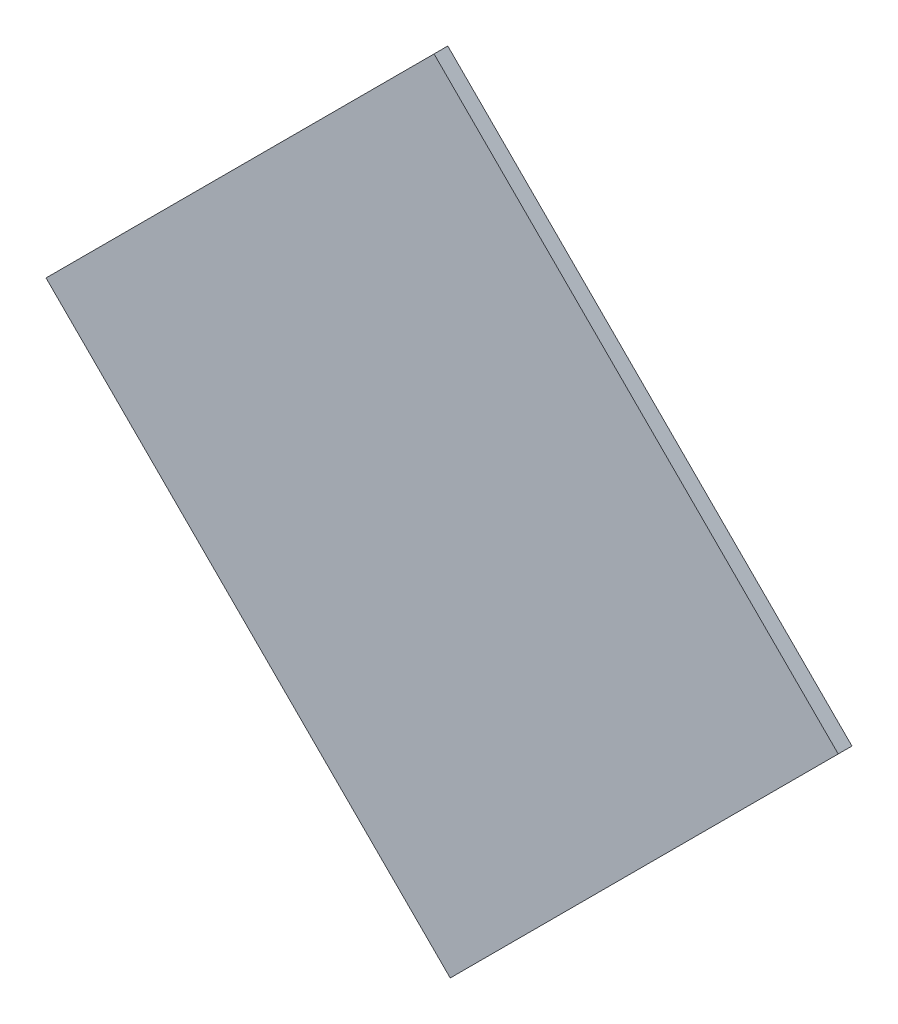
ISO-10303-21;
HEADER;
FILE_DESCRIPTION(('STEP AP214'),'2;1');
FILE_NAME('part.step','',(''),(''),'','','');
FILE_SCHEMA(('AUTOMOTIVE_DESIGN { 1 0 10303 214 1 1 1 1 }'));
ENDSEC;
DATA;
#1=APPLICATION_CONTEXT('core data for automotive mechanical design processes');
#2=APPLICATION_PROTOCOL_DEFINITION('international standard','automotive_design',2000,#1);
#3=PRODUCT_CONTEXT('',#1,'mechanical');
#4=PRODUCT('Part','Part','',(#3));
#5=PRODUCT_RELATED_PRODUCT_CATEGORY('part','',(#4));
#6=PRODUCT_DEFINITION_FORMATION('','',#4);
#7=PRODUCT_DEFINITION_CONTEXT('part definition',#1,'design');
#8=PRODUCT_DEFINITION('design','',#6,#7);
#9=PRODUCT_DEFINITION_SHAPE('','',#8);
#10=(LENGTH_UNIT() NAMED_UNIT(*) SI_UNIT(.MILLI.,.METRE.));
#11=(NAMED_UNIT(*) PLANE_ANGLE_UNIT() SI_UNIT($,.RADIAN.));
#12=(NAMED_UNIT(*) SI_UNIT($,.STERADIAN.) SOLID_ANGLE_UNIT());
#13=UNCERTAINTY_MEASURE_WITH_UNIT(LENGTH_MEASURE(1.E-05),#10,'distance_accuracy_value','');
#14=(GEOMETRIC_REPRESENTATION_CONTEXT(3) GLOBAL_UNCERTAINTY_ASSIGNED_CONTEXT((#13)) GLOBAL_UNIT_ASSIGNED_CONTEXT((#10,
#11,#12)) REPRESENTATION_CONTEXT('',''));
#15=CARTESIAN_POINT('',(0.,0.,0.));
#16=DIRECTION('',(0.,0.,1.));
#17=DIRECTION('',(1.,0.,0.));
#18=AXIS2_PLACEMENT_3D('',#15,#16,#17);
#19=CARTESIAN_POINT('',(-21.5838653891449,0.135563405102816,-0.566998912589274));
#20=CARTESIAN_POINT('',(-21.5838653880322,0.135563407137325,-0.602998912589274));
#21=CARTESIAN_POINT('',(-20.523205217365,-0.925096766677069,-0.56699893974806));
#22=CARTESIAN_POINT('',(-20.5232052162523,-0.92509676464256,-0.602998939748061));
#23=(BOUNDED_SURFACE() B_SPLINE_SURFACE(1,1,((#19,#20),(#21,#22)),.UNSPECIFIED.,.F.,.F.,
.F.) B_SPLINE_SURFACE_WITH_KNOTS((2,2),(2,2),(-0.000125000000000008,0.00137500000000008),
(0.001729772345116,0.001765772345116),
.UNSPECIFIED.) GEOMETRIC_REPRESENTATION_ITEM() RATIONAL_B_SPLINE_SURFACE(((1.,1.),(1.,1.))) REPRESENTATION_ITEM('') SURFACE());
#24=CARTESIAN_POINT('',(-20.6115935649206,-0.836708418859138,-0.569998937484828));
#25=CARTESIAN_POINT('',(-21.4954770414038,0.0471750576240548,-0.569998914852506));
#26=(BOUNDED_CURVE() B_SPLINE_CURVE(1,(#24,#25),.UNSPECIFIED.,.F.,
.F.) B_SPLINE_CURVE_WITH_KNOTS((2,2),(-0.00125,0.),
.UNSPECIFIED.) CURVE() GEOMETRIC_REPRESENTATION_ITEM() RATIONAL_B_SPLINE_CURVE((1.,1.)) REPRESENTATION_ITEM(''));
#27=CARTESIAN_POINT('',(-20.6115935649206,-0.836708418859133,-0.569998937484828));
#28=VERTEX_POINT('',#27);
#29=CARTESIAN_POINT('',(-21.4954770414038,0.0471750576240548,-0.569998914852506));
#30=VERTEX_POINT('',#29);
#31=EDGE_CURVE('E90',#28,#30,#26,.T.);
#32=CARTESIAN_POINT('',(-20.6115935649205,-0.83670841885914,-0.569998937484828));
#33=CARTESIAN_POINT('',(-20.6115935639933,-0.836708417163716,-0.599998937484828));
#34=(BOUNDED_CURVE() B_SPLINE_CURVE(1,(#32,#33),.UNSPECIFIED.,.F.,
.F.) B_SPLINE_CURVE_WITH_KNOTS((2,2),(0.001732772345116,0.001762772345116),
.UNSPECIFIED.) CURVE() GEOMETRIC_REPRESENTATION_ITEM() RATIONAL_B_SPLINE_CURVE((1.,1.)) REPRESENTATION_ITEM(''));
#35=CARTESIAN_POINT('',(-20.6115935639933,-0.836708417163712,-0.599998937484828));
#36=VERTEX_POINT('',#35);
#37=EDGE_CURVE('E70',#28,#36,#34,.T.);
#38=CARTESIAN_POINT('',(-21.4954770404765,0.0471750593194764,-0.599998914852506));
#39=CARTESIAN_POINT('',(-20.6115935639933,-0.836708417163718,-0.599998937484828));
#40=(BOUNDED_CURVE() B_SPLINE_CURVE(1,(#38,#39),.UNSPECIFIED.,.F.,
.F.) B_SPLINE_CURVE_WITH_KNOTS((2,2),(0.,0.00125),
.UNSPECIFIED.) CURVE() GEOMETRIC_REPRESENTATION_ITEM() RATIONAL_B_SPLINE_CURVE((1.,1.)) REPRESENTATION_ITEM(''));
#41=CARTESIAN_POINT('',(-21.4954770404765,0.0471750593194764,-0.599998914852506));
#42=VERTEX_POINT('',#41);
#43=EDGE_CURVE('E81',#42,#36,#40,.T.);
#44=CARTESIAN_POINT('',(-21.4954770414038,0.0471750576240343,-0.569998914852506));
#45=CARTESIAN_POINT('',(-21.4954770404766,0.0471750593194586,-0.599998914852506));
#46=(BOUNDED_CURVE() B_SPLINE_CURVE(1,(#44,#45),.UNSPECIFIED.,.F.,
.F.) B_SPLINE_CURVE_WITH_KNOTS((2,2),(0.001732772345116,0.001762772345116),
.UNSPECIFIED.) CURVE() GEOMETRIC_REPRESENTATION_ITEM() RATIONAL_B_SPLINE_CURVE((1.,1.)) REPRESENTATION_ITEM(''));
#47=EDGE_CURVE('E11',#30,#42,#46,.T.);
#48=ORIENTED_EDGE('',*,*,#31,.F.);
#49=ORIENTED_EDGE('',*,*,#37,.T.);
#50=ORIENTED_EDGE('',*,*,#43,.F.);
#51=ORIENTED_EDGE('',*,*,#47,.F.);
#52=EDGE_LOOP('',(#48,#49,#50,#51));
#53=FACE_BOUND('',#52,.T.);
#54=ADVANCED_FACE('F17',(#53),#23,.T.);
#55=CARTESIAN_POINT('',(-22.4288579926628,-0.886205893711749,-0.566998996451225));
#56=CARTESIAN_POINT('',(-22.4288579915501,-0.88620589167724,-0.602998996451227));
#57=CARTESIAN_POINT('',(-21.4106242277541,0.132027871196932,-0.56699890743444));
#58=CARTESIAN_POINT('',(-21.4106242266414,0.132027873231442,-0.602998907434441));
#59=(BOUNDED_SURFACE() B_SPLINE_SURFACE(1,1,((#55,#56),(#57,#58)),.UNSPECIFIED.,.F.,.F.,
.F.) B_SPLINE_SURFACE_WITH_KNOTS((2,2),(2,2),(-0.00132,0.000120000000000078),(0.001729772345116,
0.001765772345116),
.UNSPECIFIED.) GEOMETRIC_REPRESENTATION_ITEM() RATIONAL_B_SPLINE_SURFACE(((1.,1.),(1.,1.))) REPRESENTATION_ITEM('') SURFACE());
#60=CARTESIAN_POINT('',(-21.4954770414038,0.0471750576240548,-0.569998914852506));
#61=CARTESIAN_POINT('',(-22.3440051788277,-0.801353079799828,-0.56999898903316));
#62=(BOUNDED_CURVE() B_SPLINE_CURVE(1,(#60,#61),.UNSPECIFIED.,.F.,
.F.) B_SPLINE_CURVE_WITH_KNOTS((2,2),(0.,0.00120000000000004),
.UNSPECIFIED.) CURVE() GEOMETRIC_REPRESENTATION_ITEM() RATIONAL_B_SPLINE_CURVE((1.,1.)) REPRESENTATION_ITEM(''));
#63=CARTESIAN_POINT('',(-22.3440051788277,-0.80135307979981,-0.56999898903316));
#64=VERTEX_POINT('',#63);
#65=EDGE_CURVE('E84',#30,#64,#62,.T.);
#66=CARTESIAN_POINT('',(-22.3440051779004,-0.801353078104407,-0.59999898903316));
#67=CARTESIAN_POINT('',(-21.4954770404765,0.0471750593194764,-0.599998914852506));
#68=(BOUNDED_CURVE() B_SPLINE_CURVE(1,(#66,#67),.UNSPECIFIED.,.F.,
.F.) B_SPLINE_CURVE_WITH_KNOTS((2,2),(-0.00120000000000004,0.),
.UNSPECIFIED.) CURVE() GEOMETRIC_REPRESENTATION_ITEM() RATIONAL_B_SPLINE_CURVE((1.,1.)) REPRESENTATION_ITEM(''));
#69=CARTESIAN_POINT('',(-22.3440051779004,-0.801353078104389,-0.599998989033161));
#70=VERTEX_POINT('',#69);
#71=EDGE_CURVE('E71',#70,#42,#68,.T.);
#72=CARTESIAN_POINT('',(-22.3440051788276,-0.801353079799817,-0.56999898903316));
#73=CARTESIAN_POINT('',(-22.3440051779004,-0.801353078104393,-0.599998989033161));
#74=(BOUNDED_CURVE() B_SPLINE_CURVE(1,(#72,#73),.UNSPECIFIED.,.F.,
.F.) B_SPLINE_CURVE_WITH_KNOTS((2,2),(0.001732772345116,0.001762772345116),
.UNSPECIFIED.) CURVE() GEOMETRIC_REPRESENTATION_ITEM() RATIONAL_B_SPLINE_CURVE((1.,1.)) REPRESENTATION_ITEM(''));
#75=EDGE_CURVE('E32',#64,#70,#74,.T.);
#76=ORIENTED_EDGE('',*,*,#65,.F.);
#77=ORIENTED_EDGE('',*,*,#47,.T.);
#78=ORIENTED_EDGE('',*,*,#71,.F.);
#79=ORIENTED_EDGE('',*,*,#75,.F.);
#80=EDGE_LOOP('',(#76,#77,#78,#79));
#81=FACE_BOUND('',#80,.T.);
#82=ADVANCED_FACE('F262',(#81),#59,.T.);
#83=CARTESIAN_POINT('',(-21.3717333547889,-1.77362490410087,-0.566999013928714));
#84=CARTESIAN_POINT('',(-21.3717333536761,-1.77362490206636,-0.602999013928716));
#85=CARTESIAN_POINT('',(-22.4323935265687,-0.712964732321002,-0.566998986769927));
#86=CARTESIAN_POINT('',(-22.432393525456,-0.712964730286493,-0.602998986769929));
#87=(BOUNDED_SURFACE() B_SPLINE_SURFACE(1,1,((#83,#84),(#85,#86)),.UNSPECIFIED.,.F.,.F.,
.F.) B_SPLINE_SURFACE_WITH_KNOTS((2,2),(2,2),(-0.001375,0.000125000000000056),
(0.001729772345116,0.00176577234511601),
.UNSPECIFIED.) GEOMETRIC_REPRESENTATION_ITEM() RATIONAL_B_SPLINE_SURFACE(((1.,1.),(1.,1.))) REPRESENTATION_ITEM('') SURFACE());
#88=CARTESIAN_POINT('',(-22.3440051788277,-0.80135307979981,-0.56999898903316));
#89=CARTESIAN_POINT('',(-21.4601217023445,-1.68523655628301,-0.569999011665482));
#90=(BOUNDED_CURVE() B_SPLINE_CURVE(1,(#88,#89),.UNSPECIFIED.,.F.,
.F.) B_SPLINE_CURVE_WITH_KNOTS((2,2),(0.,0.00125),
.UNSPECIFIED.) CURVE() GEOMETRIC_REPRESENTATION_ITEM() RATIONAL_B_SPLINE_CURVE((1.,1.)) REPRESENTATION_ITEM(''));
#91=CARTESIAN_POINT('',(-21.4601217023445,-1.685236556283,-0.569999011665483));
#92=VERTEX_POINT('',#91);
#93=EDGE_CURVE('E23',#64,#92,#90,.T.);
#94=CARTESIAN_POINT('',(-21.4601217014172,-1.68523655458758,-0.599999011665483));
#95=CARTESIAN_POINT('',(-22.3440051779004,-0.801353078104389,-0.599998989033161));
#96=(BOUNDED_CURVE() B_SPLINE_CURVE(1,(#94,#95),.UNSPECIFIED.,.F.,
.F.) B_SPLINE_CURVE_WITH_KNOTS((2,2),(-0.00125,0.),
.UNSPECIFIED.) CURVE() GEOMETRIC_REPRESENTATION_ITEM() RATIONAL_B_SPLINE_CURVE((1.,1.)) REPRESENTATION_ITEM(''));
#97=CARTESIAN_POINT('',(-21.4601217014172,-1.68523655458757,-0.599999011665483));
#98=VERTEX_POINT('',#97);
#99=EDGE_CURVE('E65',#98,#70,#96,.T.);
#100=CARTESIAN_POINT('',(-21.4601217023444,-1.68523655628299,-0.569999011665483));
#101=CARTESIAN_POINT('',(-21.4601217014172,-1.68523655458757,-0.599999011665483));
#102=(BOUNDED_CURVE() B_SPLINE_CURVE(1,(#100,#101),.UNSPECIFIED.,.F.,
.F.) B_SPLINE_CURVE_WITH_KNOTS((2,2),(0.001732772345116,0.001762772345116),
.UNSPECIFIED.) CURVE() GEOMETRIC_REPRESENTATION_ITEM() RATIONAL_B_SPLINE_CURVE((1.,1.)) REPRESENTATION_ITEM(''));
#103=EDGE_CURVE('E59',#92,#98,#102,.T.);
#104=ORIENTED_EDGE('',*,*,#93,.F.);
#105=ORIENTED_EDGE('',*,*,#75,.T.);
#106=ORIENTED_EDGE('',*,*,#99,.F.);
#107=ORIENTED_EDGE('',*,*,#103,.F.);
#108=EDGE_LOOP('',(#104,#105,#106,#107));
#109=FACE_BOUND('',#108,.T.);
#110=ADVANCED_FACE('F61',(#109),#87,.T.);
#111=CARTESIAN_POINT('',(-20.5267407512709,-0.751855605286292,-0.566998930066762));
#112=CARTESIAN_POINT('',(-20.5267407501582,-0.751855603251782,-0.602998930066763));
#113=CARTESIAN_POINT('',(-21.5449745161796,-1.77008937019498,-0.566999019083547));
#114=CARTESIAN_POINT('',(-21.5449745150669,-1.77008936816048,-0.602999019083548));
#115=(BOUNDED_SURFACE() B_SPLINE_SURFACE(1,1,((#111,#112),(#113,#114)),.UNSPECIFIED.,.F.,.F.,
.F.) B_SPLINE_SURFACE_WITH_KNOTS((2,2),(2,2),(-0.000120000000000008,0.00132000000000009),
(0.001729772345116,0.001765772345116),
.UNSPECIFIED.) GEOMETRIC_REPRESENTATION_ITEM() RATIONAL_B_SPLINE_SURFACE(((1.,1.),(1.,1.))) REPRESENTATION_ITEM('') SURFACE());
#116=CARTESIAN_POINT('',(-21.4601217023445,-1.68523655628301,-0.569999011665482));
#117=CARTESIAN_POINT('',(-20.6115935649206,-0.836708418859133,-0.569998937484828));
#118=(BOUNDED_CURVE() B_SPLINE_CURVE(1,(#116,#117),.UNSPECIFIED.,.F.,
.F.) B_SPLINE_CURVE_WITH_KNOTS((2,2),(-0.00120000000000004,0.),
.UNSPECIFIED.) CURVE() GEOMETRIC_REPRESENTATION_ITEM() RATIONAL_B_SPLINE_CURVE((1.,1.)) REPRESENTATION_ITEM(''));
#119=EDGE_CURVE('E75',#92,#28,#118,.T.);
#120=CARTESIAN_POINT('',(-20.6115935639933,-0.836708417163712,-0.599998937484828));
#121=CARTESIAN_POINT('',(-21.4601217014172,-1.68523655458759,-0.599999011665482));
#122=(BOUNDED_CURVE() B_SPLINE_CURVE(1,(#120,#121),.UNSPECIFIED.,.F.,
.F.) B_SPLINE_CURVE_WITH_KNOTS((2,2),(0.,0.00120000000000004),
.UNSPECIFIED.) CURVE() GEOMETRIC_REPRESENTATION_ITEM() RATIONAL_B_SPLINE_CURVE((1.,1.)) REPRESENTATION_ITEM(''));
#123=EDGE_CURVE('E117',#36,#98,#122,.T.);
#124=ORIENTED_EDGE('',*,*,#119,.F.);
#125=ORIENTED_EDGE('',*,*,#103,.T.);
#126=ORIENTED_EDGE('',*,*,#123,.F.);
#127=ORIENTED_EDGE('',*,*,#37,.F.);
#128=EDGE_LOOP('',(#124,#125,#126,#127));
#129=FACE_BOUND('',#128,.T.);
#130=ADVANCED_FACE('F76',(#129),#115,.T.);
#131=CARTESIAN_POINT('',(-22.5172463392911,-0.797817544198456,-0.599998994187993));
#132=CARTESIAN_POINT('',(-21.4565861675113,-1.85847771597831,-0.59999902134678));
#133=CARTESIAN_POINT('',(-21.4990125743824,0.220416220710212,-0.599998905171208));
#134=CARTESIAN_POINT('',(-20.4383524026026,-0.840243951069645,-0.599998932329995));
#135=(BOUNDED_SURFACE() B_SPLINE_SURFACE(1,1,((#131,#132),(#133,#134)),.UNSPECIFIED.,.F.,.F.,
.F.) B_SPLINE_SURFACE_WITH_KNOTS((2,2),(2,2),(-0.00072,0.000720000000000064),
(-0.000749999999999991,0.000750000000000061),
.UNSPECIFIED.) GEOMETRIC_REPRESENTATION_ITEM() RATIONAL_B_SPLINE_SURFACE(((1.,1.),(1.,1.))) REPRESENTATION_ITEM('') SURFACE());
#136=ORIENTED_EDGE('',*,*,#43,.T.);
#137=ORIENTED_EDGE('',*,*,#123,.T.);
#138=ORIENTED_EDGE('',*,*,#99,.T.);
#139=ORIENTED_EDGE('',*,*,#71,.T.);
#140=EDGE_LOOP('',(#136,#137,#138,#139));
#141=FACE_BOUND('',#140,.T.);
#142=ADVANCED_FACE('F19',(#141),#135,.T.);
#143=CARTESIAN_POINT('',(-20.4383524035299,-0.840243952765066,-0.569998932329994));
#144=CARTESIAN_POINT('',(-21.4565861684386,-1.85847771767373,-0.56999902134678));
#145=CARTESIAN_POINT('',(-21.4990125753097,0.220416219014789,-0.569998905171208));
#146=CARTESIAN_POINT('',(-22.5172463402184,-0.797817545893878,-0.569998994187993));
#147=(BOUNDED_SURFACE() B_SPLINE_SURFACE(1,1,((#143,#144),(#145,#146)),.UNSPECIFIED.,.F.,.F.,
.F.) B_SPLINE_SURFACE_WITH_KNOTS((2,2),(2,2),(0.00188875271570297,0.00338875271570302),
(0.00024999999999998,0.00169000000000004),
.UNSPECIFIED.) GEOMETRIC_REPRESENTATION_ITEM() RATIONAL_B_SPLINE_SURFACE(((1.,1.),(1.,1.))) REPRESENTATION_ITEM('') SURFACE());
#148=ORIENTED_EDGE('',*,*,#31,.T.);
#149=ORIENTED_EDGE('',*,*,#65,.T.);
#150=ORIENTED_EDGE('',*,*,#93,.T.);
#151=ORIENTED_EDGE('',*,*,#119,.T.);
#152=EDGE_LOOP('',(#148,#149,#150,#151));
#153=FACE_BOUND('',#152,.T.);
#154=ADVANCED_FACE('F83',(#153),#147,.T.);
#155=CLOSED_SHELL('',(#54,#82,#110,#130,#142,#154));
#156=MANIFOLD_SOLID_BREP('B1',#155);
#157=ADVANCED_BREP_SHAPE_REPRESENTATION('',(#18,#156),#14);
#158=SHAPE_DEFINITION_REPRESENTATION(#9,#157);
ENDSEC;
END-ISO-10303-21;
